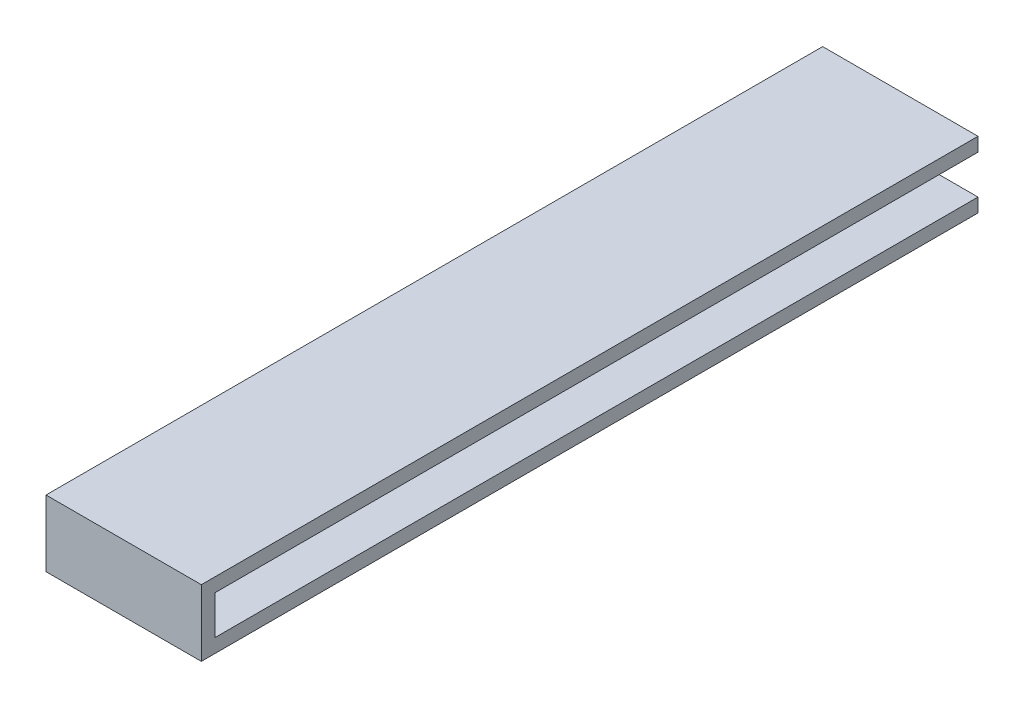
ISO-10303-21;
HEADER;
FILE_DESCRIPTION(('STEP AP214'),'2;1');
FILE_NAME('part.step','',(''),(''),'','','');
FILE_SCHEMA(('AUTOMOTIVE_DESIGN { 1 0 10303 214 1 1 1 1 }'));
ENDSEC;
DATA;
#1=APPLICATION_CONTEXT('core data for automotive mechanical design processes');
#2=APPLICATION_PROTOCOL_DEFINITION('international standard','automotive_design',2000,#1);
#3=PRODUCT_CONTEXT('',#1,'mechanical');
#4=PRODUCT('Part','Part','',(#3));
#5=PRODUCT_RELATED_PRODUCT_CATEGORY('part','',(#4));
#6=PRODUCT_DEFINITION_FORMATION('','',#4);
#7=PRODUCT_DEFINITION_CONTEXT('part definition',#1,'design');
#8=PRODUCT_DEFINITION('design','',#6,#7);
#9=PRODUCT_DEFINITION_SHAPE('','',#8);
#10=(LENGTH_UNIT() NAMED_UNIT(*) SI_UNIT(.MILLI.,.METRE.));
#11=(NAMED_UNIT(*) PLANE_ANGLE_UNIT() SI_UNIT($,.RADIAN.));
#12=(NAMED_UNIT(*) SI_UNIT($,.STERADIAN.) SOLID_ANGLE_UNIT());
#13=UNCERTAINTY_MEASURE_WITH_UNIT(LENGTH_MEASURE(1.E-05),#10,'distance_accuracy_value','');
#14=(GEOMETRIC_REPRESENTATION_CONTEXT(3) GLOBAL_UNCERTAINTY_ASSIGNED_CONTEXT((#13)) GLOBAL_UNIT_ASSIGNED_CONTEXT((#10,
#11,#12)) REPRESENTATION_CONTEXT('',''));
#15=CARTESIAN_POINT('',(0.,0.,0.));
#16=DIRECTION('',(0.,0.,1.));
#17=DIRECTION('',(1.,0.,0.));
#18=AXIS2_PLACEMENT_3D('',#15,#16,#17);
#19=CARTESIAN_POINT('',(0.,0.17112,-0.03556));
#20=DIRECTION('',(0.,0.,1.));
#21=DIRECTION('',(1.,0.,0.));
#22=AXIS2_PLACEMENT_3D('',#19,#20,#21);
#23=PLANE('',#22);
#24=DIRECTION('',(-1.,0.,0.));
#25=VECTOR('',#24,1.);
#26=CARTESIAN_POINT('',(0.,0.13556,-0.03556));
#27=LINE('',#26,#25);
#28=CARTESIAN_POINT('',(0.,0.13556,-0.03556));
#29=VERTEX_POINT('',#28);
#30=CARTESIAN_POINT('',(-0.4,0.13556,-0.03556));
#31=VERTEX_POINT('',#30);
#32=EDGE_CURVE('E150',#29,#31,#27,.T.);
#33=ORIENTED_EDGE('',*,*,#32,.F.);
#34=DIRECTION('',(0.,-1.,0.));
#35=VECTOR('',#34,1.);
#36=CARTESIAN_POINT('',(0.,0.17112,-0.03556));
#37=LINE('',#36,#35);
#38=CARTESIAN_POINT('',(0.,0.03556,-0.03556));
#39=VERTEX_POINT('',#38);
#40=EDGE_CURVE('E36',#29,#39,#37,.T.);
#41=ORIENTED_EDGE('',*,*,#40,.T.);
#42=DIRECTION('',(-1.,0.,0.));
#43=VECTOR('',#42,1.);
#44=CARTESIAN_POINT('',(0.,0.03556,-0.03556));
#45=LINE('',#44,#43);
#46=CARTESIAN_POINT('',(-0.4,0.03556,-0.03556));
#47=VERTEX_POINT('',#46);
#48=EDGE_CURVE('E125',#39,#47,#45,.T.);
#49=ORIENTED_EDGE('',*,*,#48,.T.);
#50=DIRECTION('',(0.,-1.,0.));
#51=VECTOR('',#50,1.);
#52=CARTESIAN_POINT('',(-0.4,0.17112,-0.03556));
#53=LINE('',#52,#51);
#54=EDGE_CURVE('E106',#31,#47,#53,.T.);
#55=ORIENTED_EDGE('',*,*,#54,.F.);
#56=EDGE_LOOP('',(#33,#41,#49,#55));
#57=FACE_BOUND('',#56,.T.);
#58=ADVANCED_FACE('F32',(#57),#23,.F.);
#59=CARTESIAN_POINT('',(0.,0.03556,0.));
#60=DIRECTION('',(-1.,0.,0.));
#61=DIRECTION('',(0.,0.,1.));
#62=AXIS2_PLACEMENT_3D('',#59,#60,#61);
#63=PLANE('',#62);
#64=DIRECTION('',(0.,0.,-1.));
#65=VECTOR('',#64,1.);
#66=CARTESIAN_POINT('',(0.,0.,0.));
#67=LINE('',#66,#65);
#68=CARTESIAN_POINT('',(0.,0.,0.));
#69=VERTEX_POINT('',#68);
#70=CARTESIAN_POINT('',(0.,0.,-2.));
#71=VERTEX_POINT('',#70);
#72=EDGE_CURVE('E96',#69,#71,#67,.T.);
#73=ORIENTED_EDGE('',*,*,#72,.T.);
#74=DIRECTION('',(0.,-1.,0.));
#75=VECTOR('',#74,1.);
#76=CARTESIAN_POINT('',(0.,0.03556,-2.));
#77=LINE('',#76,#75);
#78=CARTESIAN_POINT('',(0.,0.03556,-2.));
#79=VERTEX_POINT('',#78);
#80=EDGE_CURVE('E11',#79,#71,#77,.T.);
#81=ORIENTED_EDGE('',*,*,#80,.F.);
#82=DIRECTION('',(0.,0.,-1.));
#83=VECTOR('',#82,1.);
#84=CARTESIAN_POINT('',(0.,0.03556,0.));
#85=LINE('',#84,#83);
#86=EDGE_CURVE('E89',#39,#79,#85,.T.);
#87=ORIENTED_EDGE('',*,*,#86,.F.);
#88=ORIENTED_EDGE('',*,*,#40,.F.);
#89=DIRECTION('',(0.,0.,1.));
#90=VECTOR('',#89,1.);
#91=CARTESIAN_POINT('',(0.,0.13556,-2.));
#92=LINE('',#91,#90);
#93=CARTESIAN_POINT('',(0.,0.13556,-2.));
#94=VERTEX_POINT('',#93);
#95=EDGE_CURVE('E133',#94,#29,#92,.T.);
#96=ORIENTED_EDGE('',*,*,#95,.F.);
#97=DIRECTION('',(0.,-1.,0.));
#98=VECTOR('',#97,1.);
#99=CARTESIAN_POINT('',(0.,0.17112,-2.));
#100=LINE('',#99,#98);
#101=CARTESIAN_POINT('',(0.,0.17112,-2.));
#102=VERTEX_POINT('',#101);
#103=EDGE_CURVE('E153',#102,#94,#100,.T.);
#104=ORIENTED_EDGE('',*,*,#103,.F.);
#105=DIRECTION('',(0.,0.,-1.));
#106=VECTOR('',#105,1.);
#107=CARTESIAN_POINT('',(0.,0.17112,0.));
#108=LINE('',#107,#106);
#109=CARTESIAN_POINT('',(0.,0.17112,0.));
#110=VERTEX_POINT('',#109);
#111=EDGE_CURVE('E99',#110,#102,#108,.T.);
#112=ORIENTED_EDGE('',*,*,#111,.F.);
#113=DIRECTION('',(0.,-1.,0.));
#114=VECTOR('',#113,1.);
#115=CARTESIAN_POINT('',(0.,0.03556,0.));
#116=LINE('',#115,#114);
#117=EDGE_CURVE('E82',#110,#69,#116,.T.);
#118=ORIENTED_EDGE('',*,*,#117,.T.);
#119=EDGE_LOOP('',(#73,#81,#87,#88,#96,#104,#112,#118));
#120=FACE_BOUND('',#119,.T.);
#121=ADVANCED_FACE('F34',(#120),#63,.F.);
#122=CARTESIAN_POINT('',(0.,0.03556,-2.));
#123=DIRECTION('',(0.,0.,1.));
#124=DIRECTION('',(1.,0.,0.));
#125=AXIS2_PLACEMENT_3D('',#122,#123,#124);
#126=PLANE('',#125);
#127=DIRECTION('',(-1.,0.,0.));
#128=VECTOR('',#127,1.);
#129=CARTESIAN_POINT('',(0.,0.,-2.));
#130=LINE('',#129,#128);
#131=CARTESIAN_POINT('',(-0.4,0.,-2.));
#132=VERTEX_POINT('',#131);
#133=EDGE_CURVE('E103',#71,#132,#130,.T.);
#134=ORIENTED_EDGE('',*,*,#133,.T.);
#135=DIRECTION('',(0.,-1.,0.));
#136=VECTOR('',#135,1.);
#137=CARTESIAN_POINT('',(-0.4,0.03556,-2.));
#138=LINE('',#137,#136);
#139=CARTESIAN_POINT('',(-0.4,0.03556,-2.));
#140=VERTEX_POINT('',#139);
#141=EDGE_CURVE('E42',#140,#132,#138,.T.);
#142=ORIENTED_EDGE('',*,*,#141,.F.);
#143=DIRECTION('',(-1.,0.,0.));
#144=VECTOR('',#143,1.);
#145=CARTESIAN_POINT('',(0.,0.03556,-2.));
#146=LINE('',#145,#144);
#147=EDGE_CURVE('E58',#79,#140,#146,.T.);
#148=ORIENTED_EDGE('',*,*,#147,.F.);
#149=ORIENTED_EDGE('',*,*,#80,.T.);
#150=EDGE_LOOP('',(#134,#142,#148,#149));
#151=FACE_BOUND('',#150,.T.);
#152=ADVANCED_FACE('F200',(#151),#126,.F.);
#153=CARTESIAN_POINT('',(-0.4,0.03556,0.));
#154=DIRECTION('',(1.,0.,0.));
#155=DIRECTION('',(0.,0.,-1.));
#156=AXIS2_PLACEMENT_3D('',#153,#154,#155);
#157=PLANE('',#156);
#158=DIRECTION('',(0.,0.,1.));
#159=VECTOR('',#158,1.);
#160=CARTESIAN_POINT('',(-0.4,0.,0.));
#161=LINE('',#160,#159);
#162=CARTESIAN_POINT('',(-0.4,0.,0.));
#163=VERTEX_POINT('',#162);
#164=EDGE_CURVE('E90',#132,#163,#161,.T.);
#165=ORIENTED_EDGE('',*,*,#164,.T.);
#166=DIRECTION('',(0.,-1.,0.));
#167=VECTOR('',#166,1.);
#168=CARTESIAN_POINT('',(-0.4,0.03556,0.));
#169=LINE('',#168,#167);
#170=CARTESIAN_POINT('',(-0.4,0.17112,0.));
#171=VERTEX_POINT('',#170);
#172=EDGE_CURVE('E85',#171,#163,#169,.T.);
#173=ORIENTED_EDGE('',*,*,#172,.F.);
#174=DIRECTION('',(0.,0.,1.));
#175=VECTOR('',#174,1.);
#176=CARTESIAN_POINT('',(-0.4,0.17112,0.));
#177=LINE('',#176,#175);
#178=CARTESIAN_POINT('',(-0.4,0.17112,-2.));
#179=VERTEX_POINT('',#178);
#180=EDGE_CURVE('E134',#179,#171,#177,.T.);
#181=ORIENTED_EDGE('',*,*,#180,.F.);
#182=DIRECTION('',(0.,1.,0.));
#183=VECTOR('',#182,1.);
#184=CARTESIAN_POINT('',(-0.4,0.17112,-2.));
#185=LINE('',#184,#183);
#186=CARTESIAN_POINT('',(-0.4,0.13556,-2.));
#187=VERTEX_POINT('',#186);
#188=EDGE_CURVE('E156',#187,#179,#185,.T.);
#189=ORIENTED_EDGE('',*,*,#188,.F.);
#190=DIRECTION('',(0.,0.,1.));
#191=VECTOR('',#190,1.);
#192=CARTESIAN_POINT('',(-0.4,0.13556,-2.));
#193=LINE('',#192,#191);
#194=EDGE_CURVE('E137',#187,#31,#193,.T.);
#195=ORIENTED_EDGE('',*,*,#194,.T.);
#196=ORIENTED_EDGE('',*,*,#54,.T.);
#197=DIRECTION('',(0.,0.,1.));
#198=VECTOR('',#197,1.);
#199=CARTESIAN_POINT('',(-0.4,0.03556,0.));
#200=LINE('',#199,#198);
#201=EDGE_CURVE('E100',#140,#47,#200,.T.);
#202=ORIENTED_EDGE('',*,*,#201,.F.);
#203=ORIENTED_EDGE('',*,*,#141,.T.);
#204=EDGE_LOOP('',(#165,#173,#181,#189,#195,#196,#202,#203));
#205=FACE_BOUND('',#204,.T.);
#206=ADVANCED_FACE('F182',(#205),#157,.F.);
#207=CARTESIAN_POINT('',(0.,0.03556,0.));
#208=DIRECTION('',(0.,0.,-1.));
#209=DIRECTION('',(-1.,0.,0.));
#210=AXIS2_PLACEMENT_3D('',#207,#208,#209);
#211=PLANE('',#210);
#212=DIRECTION('',(1.,0.,0.));
#213=VECTOR('',#212,1.);
#214=CARTESIAN_POINT('',(0.,0.,0.));
#215=LINE('',#214,#213);
#216=EDGE_CURVE('E78',#163,#69,#215,.T.);
#217=ORIENTED_EDGE('',*,*,#216,.T.);
#218=ORIENTED_EDGE('',*,*,#117,.F.);
#219=DIRECTION('',(1.,0.,0.));
#220=VECTOR('',#219,1.);
#221=CARTESIAN_POINT('',(0.,0.17112,0.));
#222=LINE('',#221,#220);
#223=EDGE_CURVE('E142',#171,#110,#222,.T.);
#224=ORIENTED_EDGE('',*,*,#223,.F.);
#225=ORIENTED_EDGE('',*,*,#172,.T.);
#226=EDGE_LOOP('',(#217,#218,#224,#225));
#227=FACE_BOUND('',#226,.T.);
#228=ADVANCED_FACE('F80',(#227),#211,.F.);
#229=CARTESIAN_POINT('',(0.,0.03556,0.));
#230=DIRECTION('',(0.,1.,0.));
#231=DIRECTION('',(0.,0.,1.));
#232=AXIS2_PLACEMENT_3D('',#229,#230,#231);
#233=PLANE('',#232);
#234=ORIENTED_EDGE('',*,*,#48,.F.);
#235=ORIENTED_EDGE('',*,*,#86,.T.);
#236=ORIENTED_EDGE('',*,*,#147,.T.);
#237=ORIENTED_EDGE('',*,*,#201,.T.);
#238=EDGE_LOOP('',(#234,#235,#236,#237));
#239=FACE_BOUND('',#238,.T.);
#240=ADVANCED_FACE('F124',(#239),#233,.T.);
#241=CARTESIAN_POINT('',(0.,0.,0.));
#242=DIRECTION('',(0.,1.,0.));
#243=DIRECTION('',(0.,0.,1.));
#244=AXIS2_PLACEMENT_3D('',#241,#242,#243);
#245=PLANE('',#244);
#246=ORIENTED_EDGE('',*,*,#72,.F.);
#247=ORIENTED_EDGE('',*,*,#216,.F.);
#248=ORIENTED_EDGE('',*,*,#164,.F.);
#249=ORIENTED_EDGE('',*,*,#133,.F.);
#250=EDGE_LOOP('',(#246,#247,#248,#249));
#251=FACE_BOUND('',#250,.T.);
#252=ADVANCED_FACE('F102',(#251),#245,.F.);
#253=CARTESIAN_POINT('',(0.,0.17112,0.));
#254=DIRECTION('',(0.,1.,0.));
#255=DIRECTION('',(0.,0.,1.));
#256=AXIS2_PLACEMENT_3D('',#253,#254,#255);
#257=PLANE('',#256);
#258=ORIENTED_EDGE('',*,*,#111,.T.);
#259=DIRECTION('',(1.,0.,0.));
#260=VECTOR('',#259,1.);
#261=CARTESIAN_POINT('',(0.,0.17112,-2.));
#262=LINE('',#261,#260);
#263=EDGE_CURVE('E149',#179,#102,#262,.T.);
#264=ORIENTED_EDGE('',*,*,#263,.F.);
#265=ORIENTED_EDGE('',*,*,#180,.T.);
#266=ORIENTED_EDGE('',*,*,#223,.T.);
#267=EDGE_LOOP('',(#258,#264,#265,#266));
#268=FACE_BOUND('',#267,.T.);
#269=ADVANCED_FACE('F185',(#268),#257,.T.);
#270=CARTESIAN_POINT('',(0.,0.13556,-2.));
#271=DIRECTION('',(0.,1.,0.));
#272=DIRECTION('',(0.,0.,1.));
#273=AXIS2_PLACEMENT_3D('',#270,#271,#272);
#274=PLANE('',#273);
#275=ORIENTED_EDGE('',*,*,#32,.T.);
#276=ORIENTED_EDGE('',*,*,#194,.F.);
#277=DIRECTION('',(-1.,0.,0.));
#278=VECTOR('',#277,1.);
#279=CARTESIAN_POINT('',(0.,0.13556,-2.));
#280=LINE('',#279,#278);
#281=EDGE_CURVE('E159',#94,#187,#280,.T.);
#282=ORIENTED_EDGE('',*,*,#281,.F.);
#283=ORIENTED_EDGE('',*,*,#95,.T.);
#284=EDGE_LOOP('',(#275,#276,#282,#283));
#285=FACE_BOUND('',#284,.T.);
#286=ADVANCED_FACE('F174',(#285),#274,.F.);
#287=CARTESIAN_POINT('',(0.,0.,-2.));
#288=DIRECTION('',(0.,0.,-1.));
#289=DIRECTION('',(-1.,0.,0.));
#290=AXIS2_PLACEMENT_3D('',#287,#288,#289);
#291=PLANE('',#290);
#292=ORIENTED_EDGE('',*,*,#103,.T.);
#293=ORIENTED_EDGE('',*,*,#281,.T.);
#294=ORIENTED_EDGE('',*,*,#188,.T.);
#295=ORIENTED_EDGE('',*,*,#263,.T.);
#296=EDGE_LOOP('',(#292,#293,#294,#295));
#297=FACE_BOUND('',#296,.T.);
#298=ADVANCED_FACE('F166',(#297),#291,.T.);
#299=CLOSED_SHELL('',(#58,#121,#152,#206,#228,#240,#252,#269,#286,#298));
#300=MANIFOLD_SOLID_BREP('B2',#299);
#301=ADVANCED_BREP_SHAPE_REPRESENTATION('',(#18,#300),#14);
#302=SHAPE_DEFINITION_REPRESENTATION(#9,#301);
ENDSEC;
END-ISO-10303-21;
